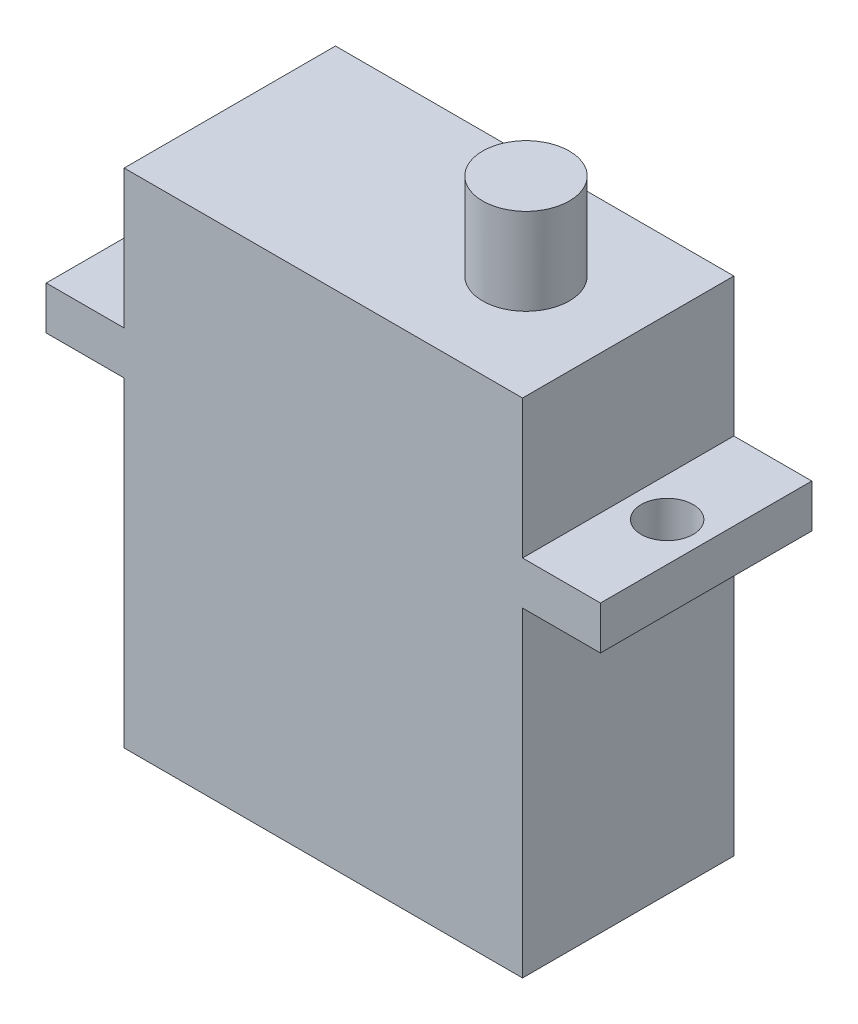
ISO-10303-21;
HEADER;
FILE_DESCRIPTION(('STEP AP214'),'2;1');
FILE_NAME('part.step','',(''),(''),'','','');
FILE_SCHEMA(('AUTOMOTIVE_DESIGN { 1 0 10303 214 1 1 1 1 }'));
ENDSEC;
DATA;
#1=APPLICATION_CONTEXT('core data for automotive mechanical design processes');
#2=APPLICATION_PROTOCOL_DEFINITION('international standard','automotive_design',2000,#1);
#3=PRODUCT_CONTEXT('',#1,'mechanical');
#4=PRODUCT('Part','Part','',(#3));
#5=PRODUCT_RELATED_PRODUCT_CATEGORY('part','',(#4));
#6=PRODUCT_DEFINITION_FORMATION('','',#4);
#7=PRODUCT_DEFINITION_CONTEXT('part definition',#1,'design');
#8=PRODUCT_DEFINITION('design','',#6,#7);
#9=PRODUCT_DEFINITION_SHAPE('','',#8);
#10=(LENGTH_UNIT() NAMED_UNIT(*) SI_UNIT(.MILLI.,.METRE.));
#11=(NAMED_UNIT(*) PLANE_ANGLE_UNIT() SI_UNIT($,.RADIAN.));
#12=(NAMED_UNIT(*) SI_UNIT($,.STERADIAN.) SOLID_ANGLE_UNIT());
#13=UNCERTAINTY_MEASURE_WITH_UNIT(LENGTH_MEASURE(1.E-05),#10,'distance_accuracy_value','');
#14=(GEOMETRIC_REPRESENTATION_CONTEXT(3) GLOBAL_UNCERTAINTY_ASSIGNED_CONTEXT((#13)) GLOBAL_UNIT_ASSIGNED_CONTEXT((#10,
#11,#12)) REPRESENTATION_CONTEXT('',''));
#15=CARTESIAN_POINT('',(0.,0.,0.));
#16=DIRECTION('',(0.,0.,1.));
#17=DIRECTION('',(1.,0.,0.));
#18=AXIS2_PLACEMENT_3D('',#15,#16,#17);
#19=CARTESIAN_POINT('',(11.5,29.,6.1));
#20=DIRECTION('',(-1.,0.,0.));
#21=DIRECTION('',(0.,0.,1.));
#22=AXIS2_PLACEMENT_3D('',#19,#20,#21);
#23=PLANE('',#22);
#24=DIRECTION('',(0.,-1.,0.));
#25=VECTOR('',#24,1.);
#26=CARTESIAN_POINT('',(11.5,29.,-6.1));
#27=LINE('',#26,#25);
#28=CARTESIAN_POINT('',(11.5,18.5,-6.1));
#29=VERTEX_POINT('',#28);
#30=CARTESIAN_POINT('',(11.5,0.,-6.1));
#31=VERTEX_POINT('',#30);
#32=EDGE_CURVE('E67',#29,#31,#27,.T.);
#33=ORIENTED_EDGE('',*,*,#32,.F.);
#34=DIRECTION('',(0.,0.,1.));
#35=VECTOR('',#34,1.);
#36=CARTESIAN_POINT('',(11.5,18.5,6.1));
#37=LINE('',#36,#35);
#38=CARTESIAN_POINT('',(11.5,18.5,6.1));
#39=VERTEX_POINT('',#38);
#40=EDGE_CURVE('E211',#29,#39,#37,.T.);
#41=ORIENTED_EDGE('',*,*,#40,.T.);
#42=DIRECTION('',(0.,-1.,0.));
#43=VECTOR('',#42,1.);
#44=CARTESIAN_POINT('',(11.5,29.,6.1));
#45=LINE('',#44,#43);
#46=CARTESIAN_POINT('',(11.5,0.,6.1));
#47=VERTEX_POINT('',#46);
#48=EDGE_CURVE('E229',#39,#47,#45,.T.);
#49=ORIENTED_EDGE('',*,*,#48,.T.);
#50=DIRECTION('',(0.,0.,-1.));
#51=VECTOR('',#50,1.);
#52=CARTESIAN_POINT('',(11.5,0.,6.1));
#53=LINE('',#52,#51);
#54=EDGE_CURVE('E214',#47,#31,#53,.T.);
#55=ORIENTED_EDGE('',*,*,#54,.T.);
#56=EDGE_LOOP('',(#33,#41,#49,#55));
#57=FACE_BOUND('',#56,.T.);
#58=ADVANCED_FACE('F51',(#57),#23,.F.);
#59=CARTESIAN_POINT('',(-11.5,29.,6.1));
#60=DIRECTION('',(1.,0.,0.));
#61=DIRECTION('',(0.,0.,-1.));
#62=AXIS2_PLACEMENT_3D('',#59,#60,#61);
#63=PLANE('',#62);
#64=DIRECTION('',(0.,-1.,0.));
#65=VECTOR('',#64,1.);
#66=CARTESIAN_POINT('',(-11.5,29.,6.1));
#67=LINE('',#66,#65);
#68=CARTESIAN_POINT('',(-11.5,18.5,6.1));
#69=VERTEX_POINT('',#68);
#70=CARTESIAN_POINT('',(-11.5,0.,6.1));
#71=VERTEX_POINT('',#70);
#72=EDGE_CURVE('E246',#69,#71,#67,.T.);
#73=ORIENTED_EDGE('',*,*,#72,.F.);
#74=DIRECTION('',(0.,0.,-1.));
#75=VECTOR('',#74,1.);
#76=CARTESIAN_POINT('',(-11.5,18.5,6.1));
#77=LINE('',#76,#75);
#78=CARTESIAN_POINT('',(-11.5,18.5,-6.1));
#79=VERTEX_POINT('',#78);
#80=EDGE_CURVE('E207',#69,#79,#77,.T.);
#81=ORIENTED_EDGE('',*,*,#80,.T.);
#82=DIRECTION('',(0.,-1.,0.));
#83=VECTOR('',#82,1.);
#84=CARTESIAN_POINT('',(-11.5,29.,-6.1));
#85=LINE('',#84,#83);
#86=CARTESIAN_POINT('',(-11.5,0.,-6.1));
#87=VERTEX_POINT('',#86);
#88=EDGE_CURVE('E251',#79,#87,#85,.T.);
#89=ORIENTED_EDGE('',*,*,#88,.T.);
#90=DIRECTION('',(0.,0.,1.));
#91=VECTOR('',#90,1.);
#92=CARTESIAN_POINT('',(-11.5,0.,6.1));
#93=LINE('',#92,#91);
#94=EDGE_CURVE('E236',#87,#71,#93,.T.);
#95=ORIENTED_EDGE('',*,*,#94,.T.);
#96=EDGE_LOOP('',(#73,#81,#89,#95));
#97=FACE_BOUND('',#96,.T.);
#98=ADVANCED_FACE('F275',(#97),#63,.F.);
#99=CARTESIAN_POINT('',(11.5,29.,6.1));
#100=VERTEX_POINT('',#99);
#101=CARTESIAN_POINT('',(11.5,21.,6.1));
#102=VERTEX_POINT('',#101);
#103=EDGE_CURVE('E243',#100,#102,#45,.T.);
#104=ORIENTED_EDGE('',*,*,#103,.T.);
#105=DIRECTION('',(0.,0.,-1.));
#106=VECTOR('',#105,1.);
#107=CARTESIAN_POINT('',(11.5,21.,6.1));
#108=LINE('',#107,#106);
#109=CARTESIAN_POINT('',(11.5,21.,-6.1));
#110=VERTEX_POINT('',#109);
#111=EDGE_CURVE('E75',#102,#110,#108,.T.);
#112=ORIENTED_EDGE('',*,*,#111,.T.);
#113=CARTESIAN_POINT('',(11.5,29.,-6.1));
#114=VERTEX_POINT('',#113);
#115=EDGE_CURVE('E60',#114,#110,#27,.T.);
#116=ORIENTED_EDGE('',*,*,#115,.F.);
#117=DIRECTION('',(0.,0.,-1.));
#118=VECTOR('',#117,1.);
#119=CARTESIAN_POINT('',(11.5,29.,6.1));
#120=LINE('',#119,#118);
#121=EDGE_CURVE('E215',#100,#114,#120,.T.);
#122=ORIENTED_EDGE('',*,*,#121,.F.);
#123=EDGE_LOOP('',(#104,#112,#116,#122));
#124=FACE_BOUND('',#123,.T.);
#125=ADVANCED_FACE('F53',(#124),#23,.F.);
#126=CARTESIAN_POINT('',(-11.5,29.,-6.1));
#127=DIRECTION('',(0.,0.,1.));
#128=DIRECTION('',(1.,0.,0.));
#129=AXIS2_PLACEMENT_3D('',#126,#127,#128);
#130=PLANE('',#129);
#131=ORIENTED_EDGE('',*,*,#115,.T.);
#132=DIRECTION('',(1.,0.,0.));
#133=VECTOR('',#132,1.);
#134=CARTESIAN_POINT('',(16.,21.,-6.1));
#135=LINE('',#134,#133);
#136=CARTESIAN_POINT('',(16.,21.,-6.1));
#137=VERTEX_POINT('',#136);
#138=EDGE_CURVE('E166',#110,#137,#135,.T.);
#139=ORIENTED_EDGE('',*,*,#138,.T.);
#140=DIRECTION('',(0.,-1.,0.));
#141=VECTOR('',#140,1.);
#142=CARTESIAN_POINT('',(16.,18.5,-6.1));
#143=LINE('',#142,#141);
#144=CARTESIAN_POINT('',(16.,18.5,-6.1));
#145=VERTEX_POINT('',#144);
#146=EDGE_CURVE('E165',#137,#145,#143,.T.);
#147=ORIENTED_EDGE('',*,*,#146,.T.);
#148=DIRECTION('',(-1.,0.,0.));
#149=VECTOR('',#148,1.);
#150=CARTESIAN_POINT('',(16.,18.5,-6.1));
#151=LINE('',#150,#149);
#152=EDGE_CURVE('E154',#145,#29,#151,.T.);
#153=ORIENTED_EDGE('',*,*,#152,.T.);
#154=ORIENTED_EDGE('',*,*,#32,.T.);
#155=DIRECTION('',(-1.,0.,0.));
#156=VECTOR('',#155,1.);
#157=CARTESIAN_POINT('',(-11.5,0.,-6.1));
#158=LINE('',#157,#156);
#159=EDGE_CURVE('E232',#31,#87,#158,.T.);
#160=ORIENTED_EDGE('',*,*,#159,.T.);
#161=ORIENTED_EDGE('',*,*,#88,.F.);
#162=CARTESIAN_POINT('',(-16.,18.5,-6.1));
#163=VERTEX_POINT('',#162);
#164=EDGE_CURVE('E170',#79,#163,#151,.T.);
#165=ORIENTED_EDGE('',*,*,#164,.T.);
#166=DIRECTION('',(0.,1.,0.));
#167=VECTOR('',#166,1.);
#168=CARTESIAN_POINT('',(-16.,18.5,-6.1));
#169=LINE('',#168,#167);
#170=CARTESIAN_POINT('',(-16.,21.,-6.1));
#171=VERTEX_POINT('',#170);
#172=EDGE_CURVE('E149',#163,#171,#169,.T.);
#173=ORIENTED_EDGE('',*,*,#172,.T.);
#174=CARTESIAN_POINT('',(-11.5,21.,-6.1));
#175=VERTEX_POINT('',#174);
#176=EDGE_CURVE('E157',#171,#175,#135,.T.);
#177=ORIENTED_EDGE('',*,*,#176,.T.);
#178=CARTESIAN_POINT('',(-11.5,29.,-6.1));
#179=VERTEX_POINT('',#178);
#180=EDGE_CURVE('E252',#179,#175,#85,.T.);
#181=ORIENTED_EDGE('',*,*,#180,.F.);
#182=DIRECTION('',(-1.,0.,0.));
#183=VECTOR('',#182,1.);
#184=CARTESIAN_POINT('',(-11.5,29.,-6.1));
#185=LINE('',#184,#183);
#186=EDGE_CURVE('E219',#114,#179,#185,.T.);
#187=ORIENTED_EDGE('',*,*,#186,.F.);
#188=EDGE_LOOP('',(#131,#139,#147,#153,#154,#160,#161,#165,#173,#177,#181,#187));
#189=FACE_BOUND('',#188,.T.);
#190=ADVANCED_FACE('F168',(#189),#130,.F.);
#191=ORIENTED_EDGE('',*,*,#180,.T.);
#192=DIRECTION('',(0.,0.,1.));
#193=VECTOR('',#192,1.);
#194=CARTESIAN_POINT('',(-11.5,21.,6.1));
#195=LINE('',#194,#193);
#196=CARTESIAN_POINT('',(-11.5,21.,6.1));
#197=VERTEX_POINT('',#196);
#198=EDGE_CURVE('E160',#175,#197,#195,.T.);
#199=ORIENTED_EDGE('',*,*,#198,.T.);
#200=CARTESIAN_POINT('',(-11.5,29.,6.1));
#201=VERTEX_POINT('',#200);
#202=EDGE_CURVE('E247',#201,#197,#67,.T.);
#203=ORIENTED_EDGE('',*,*,#202,.F.);
#204=DIRECTION('',(0.,0.,1.));
#205=VECTOR('',#204,1.);
#206=CARTESIAN_POINT('',(-11.5,29.,6.1));
#207=LINE('',#206,#205);
#208=EDGE_CURVE('E223',#179,#201,#207,.T.);
#209=ORIENTED_EDGE('',*,*,#208,.F.);
#210=EDGE_LOOP('',(#191,#199,#203,#209));
#211=FACE_BOUND('',#210,.T.);
#212=ADVANCED_FACE('F325',(#211),#63,.F.);
#213=CARTESIAN_POINT('',(-11.5,29.,6.1));
#214=DIRECTION('',(0.,0.,-1.));
#215=DIRECTION('',(-1.,0.,0.));
#216=AXIS2_PLACEMENT_3D('',#213,#214,#215);
#217=PLANE('',#216);
#218=ORIENTED_EDGE('',*,*,#202,.T.);
#219=DIRECTION('',(-1.,0.,0.));
#220=VECTOR('',#219,1.);
#221=CARTESIAN_POINT('',(16.,21.,6.1));
#222=LINE('',#221,#220);
#223=CARTESIAN_POINT('',(-16.,21.,6.1));
#224=VERTEX_POINT('',#223);
#225=EDGE_CURVE('E202',#197,#224,#222,.T.);
#226=ORIENTED_EDGE('',*,*,#225,.T.);
#227=DIRECTION('',(0.,-1.,0.));
#228=VECTOR('',#227,1.);
#229=CARTESIAN_POINT('',(-16.,18.5,6.1));
#230=LINE('',#229,#228);
#231=CARTESIAN_POINT('',(-16.,18.5,6.1));
#232=VERTEX_POINT('',#231);
#233=EDGE_CURVE('E150',#224,#232,#230,.T.);
#234=ORIENTED_EDGE('',*,*,#233,.T.);
#235=DIRECTION('',(1.,0.,0.));
#236=VECTOR('',#235,1.);
#237=CARTESIAN_POINT('',(16.,18.5,6.1));
#238=LINE('',#237,#236);
#239=EDGE_CURVE('E271',#232,#69,#238,.T.);
#240=ORIENTED_EDGE('',*,*,#239,.T.);
#241=ORIENTED_EDGE('',*,*,#72,.T.);
#242=DIRECTION('',(1.,0.,0.));
#243=VECTOR('',#242,1.);
#244=CARTESIAN_POINT('',(-11.5,0.,6.1));
#245=LINE('',#244,#243);
#246=EDGE_CURVE('E220',#71,#47,#245,.T.);
#247=ORIENTED_EDGE('',*,*,#246,.T.);
#248=ORIENTED_EDGE('',*,*,#48,.F.);
#249=CARTESIAN_POINT('',(16.,18.5,6.1));
#250=VERTEX_POINT('',#249);
#251=EDGE_CURVE('E281',#39,#250,#238,.T.);
#252=ORIENTED_EDGE('',*,*,#251,.T.);
#253=DIRECTION('',(0.,1.,0.));
#254=VECTOR('',#253,1.);
#255=CARTESIAN_POINT('',(16.,18.5,6.1));
#256=LINE('',#255,#254);
#257=CARTESIAN_POINT('',(16.,21.,6.1));
#258=VERTEX_POINT('',#257);
#259=EDGE_CURVE('E191',#250,#258,#256,.T.);
#260=ORIENTED_EDGE('',*,*,#259,.T.);
#261=EDGE_CURVE('E198',#258,#102,#222,.T.);
#262=ORIENTED_EDGE('',*,*,#261,.T.);
#263=ORIENTED_EDGE('',*,*,#103,.F.);
#264=DIRECTION('',(1.,0.,0.));
#265=VECTOR('',#264,1.);
#266=CARTESIAN_POINT('',(-11.5,29.,6.1));
#267=LINE('',#266,#265);
#268=EDGE_CURVE('E226',#201,#100,#267,.T.);
#269=ORIENTED_EDGE('',*,*,#268,.F.);
#270=EDGE_LOOP('',(#218,#226,#234,#240,#241,#247,#248,#252,#260,#262,#263,#269));
#271=FACE_BOUND('',#270,.T.);
#272=ADVANCED_FACE('F268',(#271),#217,.F.);
#273=CARTESIAN_POINT('',(0.,29.,0.));
#274=DIRECTION('',(0.,-1.,0.));
#275=DIRECTION('',(0.,0.,-1.));
#276=AXIS2_PLACEMENT_3D('',#273,#274,#275);
#277=PLANE('',#276);
#278=CARTESIAN_POINT('',(5.49999999999999,29.,-0.0999999999999994));
#279=DIRECTION('',(0.,-1.,0.));
#280=DIRECTION('',(0.,0.,-1.));
#281=AXIS2_PLACEMENT_3D('',#278,#279,#280);
#282=CIRCLE('',#281,2.5);
#283=CARTESIAN_POINT('',(5.49999999999999,29.,-2.6));
#284=VERTEX_POINT('',#283);
#285=EDGE_CURVE('E13',#284,#284,#282,.F.);
#286=ORIENTED_EDGE('',*,*,#285,.F.);
#287=EDGE_LOOP('',(#286));
#288=FACE_BOUND('',#287,.T.);
#289=ORIENTED_EDGE('',*,*,#121,.T.);
#290=ORIENTED_EDGE('',*,*,#186,.T.);
#291=ORIENTED_EDGE('',*,*,#208,.T.);
#292=ORIENTED_EDGE('',*,*,#268,.T.);
#293=EDGE_LOOP('',(#289,#290,#291,#292));
#294=FACE_BOUND('',#293,.T.);
#295=ADVANCED_FACE('F313',(#288,#294),#277,.F.);
#296=CARTESIAN_POINT('',(0.,0.,0.));
#297=DIRECTION('',(0.,-1.,0.));
#298=DIRECTION('',(0.,0.,-1.));
#299=AXIS2_PLACEMENT_3D('',#296,#297,#298);
#300=PLANE('',#299);
#301=ORIENTED_EDGE('',*,*,#54,.F.);
#302=ORIENTED_EDGE('',*,*,#246,.F.);
#303=ORIENTED_EDGE('',*,*,#94,.F.);
#304=ORIENTED_EDGE('',*,*,#159,.F.);
#305=EDGE_LOOP('',(#301,#302,#303,#304));
#306=FACE_BOUND('',#305,.T.);
#307=ADVANCED_FACE('F263',(#306),#300,.T.);
#308=CARTESIAN_POINT('',(-16.,18.5,38.1975076914081));
#309=DIRECTION('',(-1.,0.,0.));
#310=DIRECTION('',(0.,0.,1.));
#311=AXIS2_PLACEMENT_3D('',#308,#309,#310);
#312=PLANE('',#311);
#313=ORIENTED_EDGE('',*,*,#233,.F.);
#314=DIRECTION('',(0.,0.,-1.));
#315=VECTOR('',#314,1.);
#316=CARTESIAN_POINT('',(-16.,21.,38.1975076914081));
#317=LINE('',#316,#315);
#318=EDGE_CURVE('E144',#224,#171,#317,.T.);
#319=ORIENTED_EDGE('',*,*,#318,.T.);
#320=ORIENTED_EDGE('',*,*,#172,.F.);
#321=DIRECTION('',(0.,0.,-1.));
#322=VECTOR('',#321,1.);
#323=CARTESIAN_POINT('',(-16.,18.5,38.1975076914081));
#324=LINE('',#323,#322);
#325=EDGE_CURVE('E188',#232,#163,#324,.T.);
#326=ORIENTED_EDGE('',*,*,#325,.F.);
#327=EDGE_LOOP('',(#313,#319,#320,#326));
#328=FACE_BOUND('',#327,.T.);
#329=ADVANCED_FACE('F146',(#328),#312,.T.);
#330=CARTESIAN_POINT('',(16.,21.,38.1975076914081));
#331=DIRECTION('',(0.,1.,0.));
#332=DIRECTION('',(0.,0.,1.));
#333=AXIS2_PLACEMENT_3D('',#330,#331,#332);
#334=PLANE('',#333);
#335=CARTESIAN_POINT('',(-13.75,21.,0.));
#336=DIRECTION('',(0.,-1.,0.));
#337=DIRECTION('',(0.,0.,-1.));
#338=AXIS2_PLACEMENT_3D('',#335,#336,#337);
#339=CIRCLE('',#338,1.5);
#340=CARTESIAN_POINT('',(-13.75,21.,-1.5));
#341=VERTEX_POINT('',#340);
#342=EDGE_CURVE('E292',#341,#341,#339,.T.);
#343=ORIENTED_EDGE('',*,*,#342,.T.);
#344=EDGE_LOOP('',(#343));
#345=FACE_BOUND('',#344,.T.);
#346=ORIENTED_EDGE('',*,*,#198,.F.);
#347=ORIENTED_EDGE('',*,*,#176,.F.);
#348=ORIENTED_EDGE('',*,*,#318,.F.);
#349=ORIENTED_EDGE('',*,*,#225,.F.);
#350=EDGE_LOOP('',(#346,#347,#348,#349));
#351=FACE_BOUND('',#350,.T.);
#352=ADVANCED_FACE('F158',(#345,#351),#334,.T.);
#353=CARTESIAN_POINT('',(16.,18.5,38.1975076914081));
#354=DIRECTION('',(0.,-1.,0.));
#355=DIRECTION('',(0.,0.,-1.));
#356=AXIS2_PLACEMENT_3D('',#353,#354,#355);
#357=PLANE('',#356);
#358=CARTESIAN_POINT('',(-13.75,18.5,0.));
#359=DIRECTION('',(0.,-1.,0.));
#360=DIRECTION('',(0.,0.,-1.));
#361=AXIS2_PLACEMENT_3D('',#358,#359,#360);
#362=CIRCLE('',#361,1.5);
#363=CARTESIAN_POINT('',(-13.75,18.5,-1.5));
#364=VERTEX_POINT('',#363);
#365=EDGE_CURVE('E173',#364,#364,#362,.F.);
#366=ORIENTED_EDGE('',*,*,#365,.T.);
#367=EDGE_LOOP('',(#366));
#368=FACE_BOUND('',#367,.T.);
#369=ORIENTED_EDGE('',*,*,#80,.F.);
#370=ORIENTED_EDGE('',*,*,#239,.F.);
#371=ORIENTED_EDGE('',*,*,#325,.T.);
#372=ORIENTED_EDGE('',*,*,#164,.F.);
#373=EDGE_LOOP('',(#369,#370,#371,#372));
#374=FACE_BOUND('',#373,.T.);
#375=ADVANCED_FACE('F398',(#368,#374),#357,.T.);
#376=CARTESIAN_POINT('',(13.75,18.5,0.));
#377=DIRECTION('',(0.,-1.,0.));
#378=DIRECTION('',(0.,0.,-1.));
#379=AXIS2_PLACEMENT_3D('',#376,#377,#378);
#380=CIRCLE('',#379,1.5);
#381=CARTESIAN_POINT('',(13.75,18.5,-1.5));
#382=VERTEX_POINT('',#381);
#383=EDGE_CURVE('E178',#382,#382,#380,.T.);
#384=ORIENTED_EDGE('',*,*,#383,.F.);
#385=EDGE_LOOP('',(#384));
#386=FACE_BOUND('',#385,.T.);
#387=ORIENTED_EDGE('',*,*,#40,.F.);
#388=ORIENTED_EDGE('',*,*,#152,.F.);
#389=DIRECTION('',(0.,0.,-1.));
#390=VECTOR('',#389,1.);
#391=CARTESIAN_POINT('',(16.,18.5,38.1975076914081));
#392=LINE('',#391,#390);
#393=EDGE_CURVE('E192',#250,#145,#392,.T.);
#394=ORIENTED_EDGE('',*,*,#393,.F.);
#395=ORIENTED_EDGE('',*,*,#251,.F.);
#396=EDGE_LOOP('',(#387,#388,#394,#395));
#397=FACE_BOUND('',#396,.T.);
#398=ADVANCED_FACE('F408',(#386,#397),#357,.T.);
#399=CARTESIAN_POINT('',(13.75,21.,0.));
#400=DIRECTION('',(0.,1.,0.));
#401=DIRECTION('',(0.,0.,1.));
#402=AXIS2_PLACEMENT_3D('',#399,#400,#401);
#403=CIRCLE('',#402,1.5);
#404=CARTESIAN_POINT('',(13.75,21.,1.5));
#405=VERTEX_POINT('',#404);
#406=EDGE_CURVE('E291',#405,#405,#403,.T.);
#407=ORIENTED_EDGE('',*,*,#406,.F.);
#408=EDGE_LOOP('',(#407));
#409=FACE_BOUND('',#408,.T.);
#410=ORIENTED_EDGE('',*,*,#111,.F.);
#411=ORIENTED_EDGE('',*,*,#261,.F.);
#412=DIRECTION('',(0.,0.,-1.));
#413=VECTOR('',#412,1.);
#414=CARTESIAN_POINT('',(16.,21.,38.1975076914081));
#415=LINE('',#414,#413);
#416=EDGE_CURVE('E153',#258,#137,#415,.T.);
#417=ORIENTED_EDGE('',*,*,#416,.T.);
#418=ORIENTED_EDGE('',*,*,#138,.F.);
#419=EDGE_LOOP('',(#410,#411,#417,#418));
#420=FACE_BOUND('',#419,.T.);
#421=ADVANCED_FACE('F386',(#409,#420),#334,.T.);
#422=CARTESIAN_POINT('',(16.,18.5,38.1975076914081));
#423=DIRECTION('',(1.,0.,0.));
#424=DIRECTION('',(0.,0.,-1.));
#425=AXIS2_PLACEMENT_3D('',#422,#423,#424);
#426=PLANE('',#425);
#427=ORIENTED_EDGE('',*,*,#259,.F.);
#428=ORIENTED_EDGE('',*,*,#393,.T.);
#429=ORIENTED_EDGE('',*,*,#146,.F.);
#430=ORIENTED_EDGE('',*,*,#416,.F.);
#431=EDGE_LOOP('',(#427,#428,#429,#430));
#432=FACE_BOUND('',#431,.T.);
#433=ADVANCED_FACE('F380',(#432),#426,.T.);
#434=CARTESIAN_POINT('',(13.75,15.,0.));
#435=DIRECTION('',(0.,1.,0.));
#436=DIRECTION('',(0.,0.,1.));
#437=AXIS2_PLACEMENT_3D('',#434,#435,#436);
#438=CYLINDRICAL_SURFACE('',#437,1.5);
#439=ORIENTED_EDGE('',*,*,#383,.T.);
#440=EDGE_LOOP('',(#439));
#441=FACE_BOUND('',#440,.T.);
#442=ORIENTED_EDGE('',*,*,#406,.T.);
#443=EDGE_LOOP('',(#442));
#444=FACE_BOUND('',#443,.T.);
#445=ADVANCED_FACE('F385',(#441,#444),#438,.F.);
#446=CARTESIAN_POINT('',(-13.75,15.,0.));
#447=DIRECTION('',(0.,1.,0.));
#448=DIRECTION('',(0.,0.,1.));
#449=AXIS2_PLACEMENT_3D('',#446,#447,#448);
#450=CYLINDRICAL_SURFACE('',#449,1.5);
#451=ORIENTED_EDGE('',*,*,#365,.F.);
#452=EDGE_LOOP('',(#451));
#453=FACE_BOUND('',#452,.T.);
#454=ORIENTED_EDGE('',*,*,#342,.F.);
#455=EDGE_LOOP('',(#454));
#456=FACE_BOUND('',#455,.T.);
#457=ADVANCED_FACE('F309',(#453,#456),#450,.F.);
#458=CARTESIAN_POINT('',(5.49999999999999,34.,-0.0999999999999994));
#459=DIRECTION('',(0.,-1.,0.));
#460=DIRECTION('',(0.,0.,-1.));
#461=AXIS2_PLACEMENT_3D('',#458,#459,#460);
#462=CYLINDRICAL_SURFACE('',#461,2.5);
#463=CARTESIAN_POINT('',(5.49999999999999,34.,-0.0999999999999994));
#464=DIRECTION('',(0.,1.,0.));
#465=DIRECTION('',(0.,0.,1.));
#466=AXIS2_PLACEMENT_3D('',#463,#464,#465);
#467=CIRCLE('',#466,2.5);
#468=CARTESIAN_POINT('',(5.49999999999999,34.,2.4));
#469=VERTEX_POINT('',#468);
#470=EDGE_CURVE('E296',#469,#469,#467,.T.);
#471=ORIENTED_EDGE('',*,*,#470,.F.);
#472=EDGE_LOOP('',(#471));
#473=FACE_BOUND('',#472,.T.);
#474=ORIENTED_EDGE('',*,*,#285,.T.);
#475=EDGE_LOOP('',(#474));
#476=FACE_BOUND('',#475,.T.);
#477=ADVANCED_FACE('F306',(#473,#476),#462,.T.);
#478=CARTESIAN_POINT('',(5.49999999999999,34.,-0.0999999999999994));
#479=DIRECTION('',(0.,1.,0.));
#480=DIRECTION('',(0.,0.,1.));
#481=AXIS2_PLACEMENT_3D('',#478,#479,#480);
#482=PLANE('',#481);
#483=ORIENTED_EDGE('',*,*,#470,.T.);
#484=EDGE_LOOP('',(#483));
#485=FACE_BOUND('',#484,.T.);
#486=ADVANCED_FACE('F304',(#485),#482,.T.);
#487=CLOSED_SHELL('',(#58,#98,#125,#190,#212,#272,#295,#307,#329,#352,#375,#398,#421,#433,#445,
#457,#477,#486));
#488=MANIFOLD_SOLID_BREP('B2',#487);
#489=ADVANCED_BREP_SHAPE_REPRESENTATION('',(#18,#488),#14);
#490=SHAPE_DEFINITION_REPRESENTATION(#9,#489);
ENDSEC;
END-ISO-10303-21;
